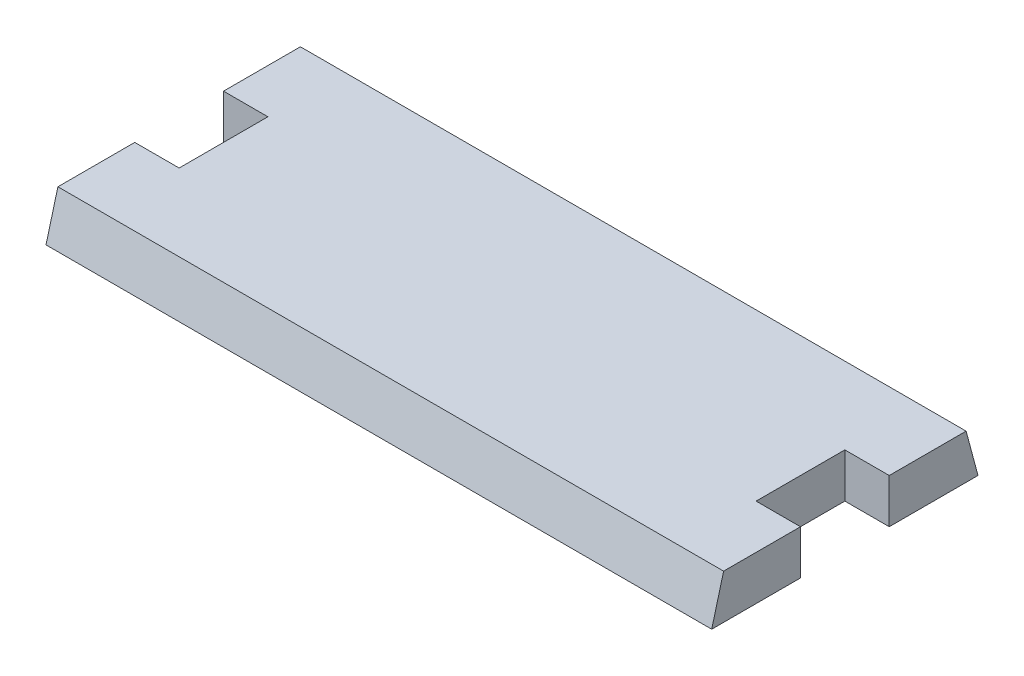
ISO-10303-21;
HEADER;
FILE_DESCRIPTION(('STEP AP214'),'2;1');
FILE_NAME('part.step','',(''),(''),'','','');
FILE_SCHEMA(('AUTOMOTIVE_DESIGN { 1 0 10303 214 1 1 1 1 }'));
ENDSEC;
DATA;
#1=APPLICATION_CONTEXT('core data for automotive mechanical design processes');
#2=APPLICATION_PROTOCOL_DEFINITION('international standard','automotive_design',2000,#1);
#3=PRODUCT_CONTEXT('',#1,'mechanical');
#4=PRODUCT('Part','Part','',(#3));
#5=PRODUCT_RELATED_PRODUCT_CATEGORY('part','',(#4));
#6=PRODUCT_DEFINITION_FORMATION('','',#4);
#7=PRODUCT_DEFINITION_CONTEXT('part definition',#1,'design');
#8=PRODUCT_DEFINITION('design','',#6,#7);
#9=PRODUCT_DEFINITION_SHAPE('','',#8);
#10=(LENGTH_UNIT() NAMED_UNIT(*) SI_UNIT(.MILLI.,.METRE.));
#11=(NAMED_UNIT(*) PLANE_ANGLE_UNIT() SI_UNIT($,.RADIAN.));
#12=(NAMED_UNIT(*) SI_UNIT($,.STERADIAN.) SOLID_ANGLE_UNIT());
#13=UNCERTAINTY_MEASURE_WITH_UNIT(LENGTH_MEASURE(1.E-05),#10,'distance_accuracy_value','');
#14=(GEOMETRIC_REPRESENTATION_CONTEXT(3) GLOBAL_UNCERTAINTY_ASSIGNED_CONTEXT((#13)) GLOBAL_UNIT_ASSIGNED_CONTEXT((#10,
#11,#12)) REPRESENTATION_CONTEXT('',''));
#15=CARTESIAN_POINT('',(0.,0.,0.));
#16=DIRECTION('',(0.,0.,1.));
#17=DIRECTION('',(1.,0.,0.));
#18=AXIS2_PLACEMENT_3D('',#15,#16,#17);
#19=CARTESIAN_POINT('',(0.,254.,0.));
#20=DIRECTION('',(-1.,0.,0.));
#21=DIRECTION('',(0.,0.,1.));
#22=AXIS2_PLACEMENT_3D('',#19,#20,#21);
#23=PLANE('',#22);
#24=DIRECTION('',(0.,0.,-1.));
#25=VECTOR('',#24,1.);
#26=CARTESIAN_POINT('',(0.,0.,0.));
#27=LINE('',#26,#25);
#28=CARTESIAN_POINT('',(0.,0.,508.));
#29=VERTEX_POINT('',#28);
#30=CARTESIAN_POINT('',(0.,0.,0.));
#31=VERTEX_POINT('',#30);
#32=EDGE_CURVE('E151',#29,#31,#27,.T.);
#33=ORIENTED_EDGE('',*,*,#32,.T.);
#34=DIRECTION('',(0.,0.965925826289068,0.258819045102521));
#35=VECTOR('',#34,1.);
#36=CARTESIAN_POINT('',(0.,0.,0.));
#37=LINE('',#36,#35);
#38=CARTESIAN_POINT('',(0.,254.,68.0590948775053));
#39=VERTEX_POINT('',#38);
#40=EDGE_CURVE('E11',#39,#31,#37,.F.);
#41=ORIENTED_EDGE('',*,*,#40,.F.);
#42=DIRECTION('',(0.,0.,-1.));
#43=VECTOR('',#42,1.);
#44=CARTESIAN_POINT('',(0.,254.,0.));
#45=LINE('',#44,#43);
#46=CARTESIAN_POINT('',(0.,254.,508.));
#47=VERTEX_POINT('',#46);
#48=EDGE_CURVE('E175',#47,#39,#45,.T.);
#49=ORIENTED_EDGE('',*,*,#48,.F.);
#50=DIRECTION('',(0.,-1.,0.));
#51=VECTOR('',#50,1.);
#52=CARTESIAN_POINT('',(0.,254.,508.));
#53=LINE('',#52,#51);
#54=EDGE_CURVE('E147',#47,#29,#53,.T.);
#55=ORIENTED_EDGE('',*,*,#54,.T.);
#56=EDGE_LOOP('',(#33,#41,#49,#55));
#57=FACE_BOUND('',#56,.T.);
#58=ADVANCED_FACE('F33',(#57),#23,.F.);
#59=CARTESIAN_POINT('',(0.,0.,0.));
#60=DIRECTION('',(0.,0.258819045102521,-0.965925826289068));
#61=DIRECTION('',(0.,0.965925826289068,0.258819045102521));
#62=AXIS2_PLACEMENT_3D('',#59,#60,#61);
#63=PLANE('',#62);
#64=DIRECTION('',(-1.,0.,0.));
#65=VECTOR('',#64,1.);
#66=CARTESIAN_POINT('',(0.,0.,0.));
#67=LINE('',#66,#65);
#68=CARTESIAN_POINT('',(-3810.,0.,0.));
#69=VERTEX_POINT('',#68);
#70=EDGE_CURVE('E154',#31,#69,#67,.T.);
#71=ORIENTED_EDGE('',*,*,#70,.T.);
#72=DIRECTION('',(0.,0.965925826289068,0.258819045102521));
#73=VECTOR('',#72,1.);
#74=CARTESIAN_POINT('',(-3810.,236.985226280624,63.5000000000001));
#75=LINE('',#74,#73);
#76=CARTESIAN_POINT('',(-3810.,254.,68.0590948775053));
#77=VERTEX_POINT('',#76);
#78=EDGE_CURVE('E43',#77,#69,#75,.F.);
#79=ORIENTED_EDGE('',*,*,#78,.F.);
#80=DIRECTION('',(1.,0.,0.));
#81=VECTOR('',#80,1.);
#82=CARTESIAN_POINT('',(0.,254.,68.0590948775053));
#83=LINE('',#82,#81);
#84=EDGE_CURVE('E193',#39,#77,#83,.F.);
#85=ORIENTED_EDGE('',*,*,#84,.F.);
#86=ORIENTED_EDGE('',*,*,#40,.T.);
#87=EDGE_LOOP('',(#71,#79,#85,#86));
#88=FACE_BOUND('',#87,.T.);
#89=ADVANCED_FACE('F218',(#88),#63,.T.);
#90=CARTESIAN_POINT('',(-3810.,254.,0.));
#91=DIRECTION('',(1.,0.,0.));
#92=DIRECTION('',(0.,0.,-1.));
#93=AXIS2_PLACEMENT_3D('',#90,#91,#92);
#94=PLANE('',#93);
#95=DIRECTION('',(0.,0.,1.));
#96=VECTOR('',#95,1.);
#97=CARTESIAN_POINT('',(-3810.,0.,0.));
#98=LINE('',#97,#96);
#99=CARTESIAN_POINT('',(-3810.,0.,508.));
#100=VERTEX_POINT('',#99);
#101=EDGE_CURVE('E156',#69,#100,#98,.T.);
#102=ORIENTED_EDGE('',*,*,#101,.T.);
#103=DIRECTION('',(0.,-1.,0.));
#104=VECTOR('',#103,1.);
#105=CARTESIAN_POINT('',(-3810.,254.,508.));
#106=LINE('',#105,#104);
#107=CARTESIAN_POINT('',(-3810.,254.,508.));
#108=VERTEX_POINT('',#107);
#109=EDGE_CURVE('E190',#108,#100,#106,.T.);
#110=ORIENTED_EDGE('',*,*,#109,.F.);
#111=DIRECTION('',(0.,0.,1.));
#112=VECTOR('',#111,1.);
#113=CARTESIAN_POINT('',(-3810.,254.,0.));
#114=LINE('',#113,#112);
#115=EDGE_CURVE('E195',#77,#108,#114,.T.);
#116=ORIENTED_EDGE('',*,*,#115,.F.);
#117=ORIENTED_EDGE('',*,*,#78,.T.);
#118=EDGE_LOOP('',(#102,#110,#116,#117));
#119=FACE_BOUND('',#118,.T.);
#120=ADVANCED_FACE('F223',(#119),#94,.F.);
#121=CARTESIAN_POINT('',(-3810.,254.,508.));
#122=DIRECTION('',(0.,0.,-1.));
#123=DIRECTION('',(-1.,0.,0.));
#124=AXIS2_PLACEMENT_3D('',#121,#122,#123);
#125=PLANE('',#124);
#126=DIRECTION('',(1.,0.,0.));
#127=VECTOR('',#126,1.);
#128=CARTESIAN_POINT('',(-3810.,0.,508.));
#129=LINE('',#128,#127);
#130=CARTESIAN_POINT('',(-3556.,0.,508.));
#131=VERTEX_POINT('',#130);
#132=EDGE_CURVE('E158',#100,#131,#129,.T.);
#133=ORIENTED_EDGE('',*,*,#132,.T.);
#134=DIRECTION('',(0.,-1.,0.));
#135=VECTOR('',#134,1.);
#136=CARTESIAN_POINT('',(-3556.,254.,508.));
#137=LINE('',#136,#135);
#138=CARTESIAN_POINT('',(-3556.,254.,508.));
#139=VERTEX_POINT('',#138);
#140=EDGE_CURVE('E187',#139,#131,#137,.T.);
#141=ORIENTED_EDGE('',*,*,#140,.F.);
#142=DIRECTION('',(1.,0.,0.));
#143=VECTOR('',#142,1.);
#144=CARTESIAN_POINT('',(-3810.,254.,508.));
#145=LINE('',#144,#143);
#146=EDGE_CURVE('E207',#108,#139,#145,.T.);
#147=ORIENTED_EDGE('',*,*,#146,.F.);
#148=ORIENTED_EDGE('',*,*,#109,.T.);
#149=EDGE_LOOP('',(#133,#141,#147,#148));
#150=FACE_BOUND('',#149,.T.);
#151=ADVANCED_FACE('F230',(#150),#125,.F.);
#152=CARTESIAN_POINT('',(-3556.,254.,508.));
#153=DIRECTION('',(1.,0.,0.));
#154=DIRECTION('',(0.,0.,-1.));
#155=AXIS2_PLACEMENT_3D('',#152,#153,#154);
#156=PLANE('',#155);
#157=DIRECTION('',(0.,0.,1.));
#158=VECTOR('',#157,1.);
#159=CARTESIAN_POINT('',(-3556.,0.,508.));
#160=LINE('',#159,#158);
#161=CARTESIAN_POINT('',(-3556.,0.,1016.));
#162=VERTEX_POINT('',#161);
#163=EDGE_CURVE('E160',#131,#162,#160,.T.);
#164=ORIENTED_EDGE('',*,*,#163,.T.);
#165=DIRECTION('',(0.,-1.,0.));
#166=VECTOR('',#165,1.);
#167=CARTESIAN_POINT('',(-3556.,254.,1016.));
#168=LINE('',#167,#166);
#169=CARTESIAN_POINT('',(-3556.,254.,1016.));
#170=VERTEX_POINT('',#169);
#171=EDGE_CURVE('E183',#170,#162,#168,.T.);
#172=ORIENTED_EDGE('',*,*,#171,.F.);
#173=DIRECTION('',(0.,0.,1.));
#174=VECTOR('',#173,1.);
#175=CARTESIAN_POINT('',(-3556.,254.,508.));
#176=LINE('',#175,#174);
#177=EDGE_CURVE('E203',#139,#170,#176,.T.);
#178=ORIENTED_EDGE('',*,*,#177,.F.);
#179=ORIENTED_EDGE('',*,*,#140,.T.);
#180=EDGE_LOOP('',(#164,#172,#178,#179));
#181=FACE_BOUND('',#180,.T.);
#182=ADVANCED_FACE('F234',(#181),#156,.F.);
#183=CARTESIAN_POINT('',(-3810.,254.,1016.));
#184=DIRECTION('',(0.,0.,1.));
#185=DIRECTION('',(1.,0.,0.));
#186=AXIS2_PLACEMENT_3D('',#183,#184,#185);
#187=PLANE('',#186);
#188=DIRECTION('',(-1.,0.,0.));
#189=VECTOR('',#188,1.);
#190=CARTESIAN_POINT('',(-3810.,0.,1016.));
#191=LINE('',#190,#189);
#192=CARTESIAN_POINT('',(-3810.,0.,1016.));
#193=VERTEX_POINT('',#192);
#194=EDGE_CURVE('E162',#162,#193,#191,.T.);
#195=ORIENTED_EDGE('',*,*,#194,.T.);
#196=DIRECTION('',(0.,-1.,0.));
#197=VECTOR('',#196,1.);
#198=CARTESIAN_POINT('',(-3810.,254.,1016.));
#199=LINE('',#198,#197);
#200=CARTESIAN_POINT('',(-3810.,254.,1016.));
#201=VERTEX_POINT('',#200);
#202=EDGE_CURVE('E180',#201,#193,#199,.T.);
#203=ORIENTED_EDGE('',*,*,#202,.F.);
#204=DIRECTION('',(-1.,0.,0.));
#205=VECTOR('',#204,1.);
#206=CARTESIAN_POINT('',(-3810.,254.,1016.));
#207=LINE('',#206,#205);
#208=EDGE_CURVE('E113',#170,#201,#207,.T.);
#209=ORIENTED_EDGE('',*,*,#208,.F.);
#210=ORIENTED_EDGE('',*,*,#171,.T.);
#211=EDGE_LOOP('',(#195,#203,#209,#210));
#212=FACE_BOUND('',#211,.T.);
#213=ADVANCED_FACE('F237',(#212),#187,.F.);
#214=CARTESIAN_POINT('',(-3810.,254.,1016.));
#215=DIRECTION('',(1.,0.,0.));
#216=DIRECTION('',(0.,0.,-1.));
#217=AXIS2_PLACEMENT_3D('',#214,#215,#216);
#218=PLANE('',#217);
#219=DIRECTION('',(0.,0.,1.));
#220=VECTOR('',#219,1.);
#221=CARTESIAN_POINT('',(-3810.,0.,1016.));
#222=LINE('',#221,#220);
#223=CARTESIAN_POINT('',(-3810.,0.,1524.));
#224=VERTEX_POINT('',#223);
#225=EDGE_CURVE('E164',#193,#224,#222,.T.);
#226=ORIENTED_EDGE('',*,*,#225,.T.);
#227=DIRECTION('',(0.,0.965925826289068,-0.258819045102521));
#228=VECTOR('',#227,1.);
#229=CARTESIAN_POINT('',(-3810.,1.11022302462516E-13,1524.));
#230=LINE('',#229,#228);
#231=CARTESIAN_POINT('',(-3810.,254.,1455.9409051225));
#232=VERTEX_POINT('',#231);
#233=EDGE_CURVE('E184',#232,#224,#230,.F.);
#234=ORIENTED_EDGE('',*,*,#233,.F.);
#235=DIRECTION('',(0.,0.,1.));
#236=VECTOR('',#235,1.);
#237=CARTESIAN_POINT('',(-3810.,254.,1016.));
#238=LINE('',#237,#236);
#239=EDGE_CURVE('E106',#201,#232,#238,.T.);
#240=ORIENTED_EDGE('',*,*,#239,.F.);
#241=ORIENTED_EDGE('',*,*,#202,.T.);
#242=EDGE_LOOP('',(#226,#234,#240,#241));
#243=FACE_BOUND('',#242,.T.);
#244=ADVANCED_FACE('F240',(#243),#218,.F.);
#245=CARTESIAN_POINT('',(1.86636172190057E-13,0.,1524.));
#246=DIRECTION('',(0.,0.258819045102521,0.965925826289068));
#247=DIRECTION('',(0.,-0.965925826289068,0.258819045102521));
#248=AXIS2_PLACEMENT_3D('',#245,#246,#247);
#249=PLANE('',#248);
#250=DIRECTION('',(1.,0.,0.));
#251=VECTOR('',#250,1.);
#252=CARTESIAN_POINT('',(1.86636172190057E-13,0.,1524.));
#253=LINE('',#252,#251);
#254=CARTESIAN_POINT('',(1.86636172190057E-13,0.,1524.));
#255=VERTEX_POINT('',#254);
#256=EDGE_CURVE('E166',#224,#255,#253,.T.);
#257=ORIENTED_EDGE('',*,*,#256,.T.);
#258=DIRECTION('',(0.,0.965925826289068,-0.258819045102521));
#259=VECTOR('',#258,1.);
#260=CARTESIAN_POINT('',(1.74692247380741E-13,363.985226280624,1426.47045256125));
#261=LINE('',#260,#259);
#262=CARTESIAN_POINT('',(1.78301336920596E-13,254.,1455.94090512249));
#263=VERTEX_POINT('',#262);
#264=EDGE_CURVE('E37',#263,#255,#261,.F.);
#265=ORIENTED_EDGE('',*,*,#264,.F.);
#266=DIRECTION('',(-1.,0.,0.));
#267=VECTOR('',#266,1.);
#268=CARTESIAN_POINT('',(1.69702794263578E-13,254.,1455.94090512249));
#269=LINE('',#268,#267);
#270=EDGE_CURVE('E199',#232,#263,#269,.F.);
#271=ORIENTED_EDGE('',*,*,#270,.F.);
#272=ORIENTED_EDGE('',*,*,#233,.T.);
#273=EDGE_LOOP('',(#257,#265,#271,#272));
#274=FACE_BOUND('',#273,.T.);
#275=ADVANCED_FACE('F35',(#274),#249,.T.);
#276=CARTESIAN_POINT('',(1.24424114793371E-13,254.,1016.));
#277=DIRECTION('',(-1.,0.,0.));
#278=DIRECTION('',(0.,0.,1.));
#279=AXIS2_PLACEMENT_3D('',#276,#277,#278);
#280=PLANE('',#279);
#281=DIRECTION('',(0.,0.,-1.));
#282=VECTOR('',#281,1.);
#283=CARTESIAN_POINT('',(1.24424114793371E-13,0.,1016.));
#284=LINE('',#283,#282);
#285=CARTESIAN_POINT('',(1.24424114793371E-13,0.,1016.));
#286=VERTEX_POINT('',#285);
#287=EDGE_CURVE('E168',#255,#286,#284,.T.);
#288=ORIENTED_EDGE('',*,*,#287,.T.);
#289=DIRECTION('',(0.,-1.,0.));
#290=VECTOR('',#289,1.);
#291=CARTESIAN_POINT('',(1.24424114793371E-13,254.,1016.));
#292=LINE('',#291,#290);
#293=CARTESIAN_POINT('',(1.24424114793371E-13,254.,1016.));
#294=VERTEX_POINT('',#293);
#295=EDGE_CURVE('E141',#294,#286,#292,.T.);
#296=ORIENTED_EDGE('',*,*,#295,.F.);
#297=DIRECTION('',(0.,0.,-1.));
#298=VECTOR('',#297,1.);
#299=CARTESIAN_POINT('',(1.24424114793371E-13,254.,1016.));
#300=LINE('',#299,#298);
#301=EDGE_CURVE('E129',#263,#294,#300,.T.);
#302=ORIENTED_EDGE('',*,*,#301,.F.);
#303=ORIENTED_EDGE('',*,*,#264,.T.);
#304=EDGE_LOOP('',(#288,#296,#302,#303));
#305=FACE_BOUND('',#304,.T.);
#306=ADVANCED_FACE('F246',(#305),#280,.F.);
#307=CARTESIAN_POINT('',(1.24424114793371E-13,254.,1016.));
#308=DIRECTION('',(0.,0.,1.));
#309=DIRECTION('',(1.,0.,0.));
#310=AXIS2_PLACEMENT_3D('',#307,#308,#309);
#311=PLANE('',#310);
#312=DIRECTION('',(-1.,0.,0.));
#313=VECTOR('',#312,1.);
#314=CARTESIAN_POINT('',(1.24424114793371E-13,0.,1016.));
#315=LINE('',#314,#313);
#316=CARTESIAN_POINT('',(-254.,0.,1016.));
#317=VERTEX_POINT('',#316);
#318=EDGE_CURVE('E138',#286,#317,#315,.T.);
#319=ORIENTED_EDGE('',*,*,#318,.T.);
#320=DIRECTION('',(0.,-1.,0.));
#321=VECTOR('',#320,1.);
#322=CARTESIAN_POINT('',(-254.,254.,1016.));
#323=LINE('',#322,#321);
#324=CARTESIAN_POINT('',(-254.,254.,1016.));
#325=VERTEX_POINT('',#324);
#326=EDGE_CURVE('E135',#325,#317,#323,.T.);
#327=ORIENTED_EDGE('',*,*,#326,.F.);
#328=DIRECTION('',(-1.,0.,0.));
#329=VECTOR('',#328,1.);
#330=CARTESIAN_POINT('',(1.24424114793371E-13,254.,1016.));
#331=LINE('',#330,#329);
#332=EDGE_CURVE('E122',#294,#325,#331,.T.);
#333=ORIENTED_EDGE('',*,*,#332,.F.);
#334=ORIENTED_EDGE('',*,*,#295,.T.);
#335=EDGE_LOOP('',(#319,#327,#333,#334));
#336=FACE_BOUND('',#335,.T.);
#337=ADVANCED_FACE('F136',(#336),#311,.F.);
#338=CARTESIAN_POINT('',(-254.,254.,508.));
#339=DIRECTION('',(-1.,0.,0.));
#340=DIRECTION('',(0.,0.,1.));
#341=AXIS2_PLACEMENT_3D('',#338,#339,#340);
#342=PLANE('',#341);
#343=DIRECTION('',(0.,0.,-1.));
#344=VECTOR('',#343,1.);
#345=CARTESIAN_POINT('',(-254.,0.,508.));
#346=LINE('',#345,#344);
#347=CARTESIAN_POINT('',(-254.,0.,508.));
#348=VERTEX_POINT('',#347);
#349=EDGE_CURVE('E171',#317,#348,#346,.T.);
#350=ORIENTED_EDGE('',*,*,#349,.T.);
#351=DIRECTION('',(0.,-1.,0.));
#352=VECTOR('',#351,1.);
#353=CARTESIAN_POINT('',(-254.,254.,508.));
#354=LINE('',#353,#352);
#355=CARTESIAN_POINT('',(-254.,254.,508.));
#356=VERTEX_POINT('',#355);
#357=EDGE_CURVE('E142',#356,#348,#354,.T.);
#358=ORIENTED_EDGE('',*,*,#357,.F.);
#359=DIRECTION('',(0.,0.,-1.));
#360=VECTOR('',#359,1.);
#361=CARTESIAN_POINT('',(-254.,254.,508.));
#362=LINE('',#361,#360);
#363=EDGE_CURVE('E126',#325,#356,#362,.T.);
#364=ORIENTED_EDGE('',*,*,#363,.F.);
#365=ORIENTED_EDGE('',*,*,#326,.T.);
#366=EDGE_LOOP('',(#350,#358,#364,#365));
#367=FACE_BOUND('',#366,.T.);
#368=ADVANCED_FACE('F144',(#367),#342,.F.);
#369=CARTESIAN_POINT('',(0.,254.,508.));
#370=DIRECTION('',(0.,0.,-1.));
#371=DIRECTION('',(-1.,0.,0.));
#372=AXIS2_PLACEMENT_3D('',#369,#370,#371);
#373=PLANE('',#372);
#374=DIRECTION('',(1.,0.,0.));
#375=VECTOR('',#374,1.);
#376=CARTESIAN_POINT('',(0.,0.,508.));
#377=LINE('',#376,#375);
#378=EDGE_CURVE('E173',#348,#29,#377,.T.);
#379=ORIENTED_EDGE('',*,*,#378,.T.);
#380=ORIENTED_EDGE('',*,*,#54,.F.);
#381=DIRECTION('',(1.,0.,0.));
#382=VECTOR('',#381,1.);
#383=CARTESIAN_POINT('',(0.,254.,508.));
#384=LINE('',#383,#382);
#385=EDGE_CURVE('E52',#356,#47,#384,.T.);
#386=ORIENTED_EDGE('',*,*,#385,.F.);
#387=ORIENTED_EDGE('',*,*,#357,.T.);
#388=EDGE_LOOP('',(#379,#380,#386,#387));
#389=FACE_BOUND('',#388,.T.);
#390=ADVANCED_FACE('F251',(#389),#373,.F.);
#391=CARTESIAN_POINT('',(0.,254.,0.));
#392=DIRECTION('',(0.,-1.,0.));
#393=DIRECTION('',(0.,0.,-1.));
#394=AXIS2_PLACEMENT_3D('',#391,#392,#393);
#395=PLANE('',#394);
#396=ORIENTED_EDGE('',*,*,#48,.T.);
#397=ORIENTED_EDGE('',*,*,#84,.T.);
#398=ORIENTED_EDGE('',*,*,#115,.T.);
#399=ORIENTED_EDGE('',*,*,#146,.T.);
#400=ORIENTED_EDGE('',*,*,#177,.T.);
#401=ORIENTED_EDGE('',*,*,#208,.T.);
#402=ORIENTED_EDGE('',*,*,#239,.T.);
#403=ORIENTED_EDGE('',*,*,#270,.T.);
#404=ORIENTED_EDGE('',*,*,#301,.T.);
#405=ORIENTED_EDGE('',*,*,#332,.T.);
#406=ORIENTED_EDGE('',*,*,#363,.T.);
#407=ORIENTED_EDGE('',*,*,#385,.T.);
#408=EDGE_LOOP('',(#396,#397,#398,#399,#400,#401,#402,#403,#404,#405,#406,#407));
#409=FACE_BOUND('',#408,.T.);
#410=ADVANCED_FACE('F124',(#409),#395,.F.);
#411=CARTESIAN_POINT('',(0.,0.,0.));
#412=DIRECTION('',(0.,-1.,0.));
#413=DIRECTION('',(0.,0.,-1.));
#414=AXIS2_PLACEMENT_3D('',#411,#412,#413);
#415=PLANE('',#414);
#416=ORIENTED_EDGE('',*,*,#32,.F.);
#417=ORIENTED_EDGE('',*,*,#378,.F.);
#418=ORIENTED_EDGE('',*,*,#349,.F.);
#419=ORIENTED_EDGE('',*,*,#318,.F.);
#420=ORIENTED_EDGE('',*,*,#287,.F.);
#421=ORIENTED_EDGE('',*,*,#256,.F.);
#422=ORIENTED_EDGE('',*,*,#225,.F.);
#423=ORIENTED_EDGE('',*,*,#194,.F.);
#424=ORIENTED_EDGE('',*,*,#163,.F.);
#425=ORIENTED_EDGE('',*,*,#132,.F.);
#426=ORIENTED_EDGE('',*,*,#101,.F.);
#427=ORIENTED_EDGE('',*,*,#70,.F.);
#428=EDGE_LOOP('',(#416,#417,#418,#419,#420,#421,#422,#423,#424,#425,#426,#427));
#429=FACE_BOUND('',#428,.T.);
#430=ADVANCED_FACE('F248',(#429),#415,.T.);
#431=CLOSED_SHELL('',(#58,#89,#120,#151,#182,#213,#244,#275,#306,#337,#368,#390,#410,#430));
#432=MANIFOLD_SOLID_BREP('B2',#431);
#433=ADVANCED_BREP_SHAPE_REPRESENTATION('',(#18,#432),#14);
#434=SHAPE_DEFINITION_REPRESENTATION(#9,#433);
ENDSEC;
END-ISO-10303-21;
